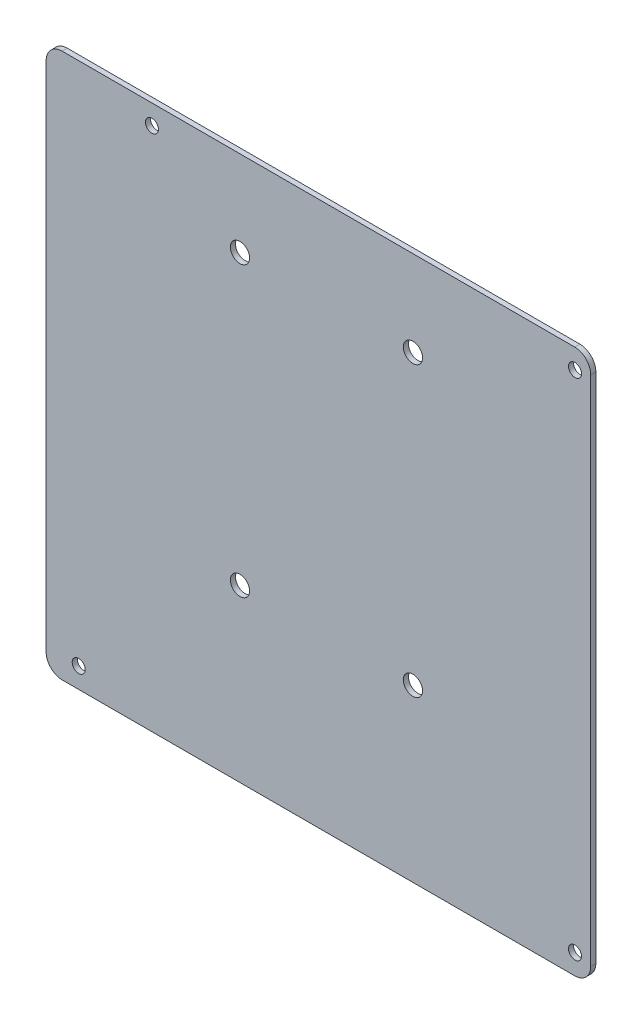
ISO-10303-21;
HEADER;
FILE_DESCRIPTION(('STEP AP214'),'2;1');
FILE_NAME('part.step','',(''),(''),'','','');
FILE_SCHEMA(('AUTOMOTIVE_DESIGN { 1 0 10303 214 1 1 1 1 }'));
ENDSEC;
DATA;
#1=APPLICATION_CONTEXT('core data for automotive mechanical design processes');
#2=APPLICATION_PROTOCOL_DEFINITION('international standard','automotive_design',2000,#1);
#3=PRODUCT_CONTEXT('',#1,'mechanical');
#4=PRODUCT('Part','Part','',(#3));
#5=PRODUCT_RELATED_PRODUCT_CATEGORY('part','',(#4));
#6=PRODUCT_DEFINITION_FORMATION('','',#4);
#7=PRODUCT_DEFINITION_CONTEXT('part definition',#1,'design');
#8=PRODUCT_DEFINITION('design','',#6,#7);
#9=PRODUCT_DEFINITION_SHAPE('','',#8);
#10=(LENGTH_UNIT() NAMED_UNIT(*) SI_UNIT(.MILLI.,.METRE.));
#11=(NAMED_UNIT(*) PLANE_ANGLE_UNIT() SI_UNIT($,.RADIAN.));
#12=(NAMED_UNIT(*) SI_UNIT($,.STERADIAN.) SOLID_ANGLE_UNIT());
#13=UNCERTAINTY_MEASURE_WITH_UNIT(LENGTH_MEASURE(1.E-05),#10,'distance_accuracy_value','');
#14=(GEOMETRIC_REPRESENTATION_CONTEXT(3) GLOBAL_UNCERTAINTY_ASSIGNED_CONTEXT((#13)) GLOBAL_UNIT_ASSIGNED_CONTEXT((#10,
#11,#12)) REPRESENTATION_CONTEXT('',''));
#15=CARTESIAN_POINT('',(0.,0.,0.));
#16=DIRECTION('',(0.,0.,1.));
#17=DIRECTION('',(1.,0.,0.));
#18=AXIS2_PLACEMENT_3D('',#15,#16,#17);
#19=CARTESIAN_POINT('',(149.920268508057,-111.047181825984,1.6));
#20=DIRECTION('',(0.,0.,-1.));
#21=DIRECTION('',(-1.,0.,0.));
#22=AXIS2_PLACEMENT_3D('',#19,#20,#21);
#23=PLANE('',#22);
#24=CARTESIAN_POINT('',(149.920268508057,-111.047181825984,1.6));
#25=DIRECTION('',(0.,0.,1.));
#26=DIRECTION('',(-1.,0.,0.));
#27=AXIS2_PLACEMENT_3D('',#24,#25,#26);
#28=CIRCLE('',#27,5.);
#29=CARTESIAN_POINT('',(149.920268508057,-116.047181825984,1.6));
#30=VERTEX_POINT('',#29);
#31=CARTESIAN_POINT('',(154.920268508057,-111.047181825984,1.6));
#32=VERTEX_POINT('',#31);
#33=EDGE_CURVE('E145',#30,#32,#28,.T.);
#34=ORIENTED_EDGE('',*,*,#33,.T.);
#35=DIRECTION('',(0.,1.,0.));
#36=VECTOR('',#35,1.);
#37=CARTESIAN_POINT('',(154.920268508057,48.9528181740162,1.6));
#38=LINE('',#37,#36);
#39=CARTESIAN_POINT('',(154.920268508057,48.9528181740162,1.6));
#40=VERTEX_POINT('',#39);
#41=EDGE_CURVE('E93',#32,#40,#38,.T.);
#42=ORIENTED_EDGE('',*,*,#41,.T.);
#43=CARTESIAN_POINT('',(149.920268508057,48.9528181740163,1.6));
#44=DIRECTION('',(0.,0.,1.));
#45=DIRECTION('',(-1.,0.,0.));
#46=AXIS2_PLACEMENT_3D('',#43,#44,#45);
#47=CIRCLE('',#46,5.);
#48=CARTESIAN_POINT('',(149.920268508057,53.9528181740163,1.6));
#49=VERTEX_POINT('',#48);
#50=EDGE_CURVE('E160',#40,#49,#47,.T.);
#51=ORIENTED_EDGE('',*,*,#50,.T.);
#52=DIRECTION('',(-1.,0.,0.));
#53=VECTOR('',#52,1.);
#54=CARTESIAN_POINT('',(-10.0797314919425,53.9528181740163,1.6));
#55=LINE('',#54,#53);
#56=CARTESIAN_POINT('',(-10.0797314919425,53.9528181740163,1.6));
#57=VERTEX_POINT('',#56);
#58=EDGE_CURVE('E173',#49,#57,#55,.T.);
#59=ORIENTED_EDGE('',*,*,#58,.T.);
#60=CARTESIAN_POINT('',(-10.0797314919426,48.9528181740163,1.6));
#61=DIRECTION('',(0.,0.,1.));
#62=DIRECTION('',(-1.,0.,0.));
#63=AXIS2_PLACEMENT_3D('',#60,#61,#62);
#64=CIRCLE('',#63,5.);
#65=CARTESIAN_POINT('',(-15.0797314919426,48.9528181740162,1.6));
#66=VERTEX_POINT('',#65);
#67=EDGE_CURVE('E112',#57,#66,#64,.T.);
#68=ORIENTED_EDGE('',*,*,#67,.T.);
#69=DIRECTION('',(0.,-1.,0.));
#70=VECTOR('',#69,1.);
#71=CARTESIAN_POINT('',(-15.0797314919426,-111.047181825984,1.6));
#72=LINE('',#71,#70);
#73=CARTESIAN_POINT('',(-15.0797314919426,-111.047181825984,1.6));
#74=VERTEX_POINT('',#73);
#75=EDGE_CURVE('E106',#66,#74,#72,.T.);
#76=ORIENTED_EDGE('',*,*,#75,.T.);
#77=CARTESIAN_POINT('',(-10.0797314919426,-111.047181825984,1.6));
#78=DIRECTION('',(0.,0.,1.));
#79=DIRECTION('',(1.,0.,0.));
#80=AXIS2_PLACEMENT_3D('',#77,#78,#79);
#81=CIRCLE('',#80,5.);
#82=CARTESIAN_POINT('',(-10.0797314919425,-116.047181825984,1.6));
#83=VERTEX_POINT('',#82);
#84=EDGE_CURVE('E110',#74,#83,#81,.T.);
#85=ORIENTED_EDGE('',*,*,#84,.T.);
#86=DIRECTION('',(1.,0.,0.));
#87=VECTOR('',#86,1.);
#88=CARTESIAN_POINT('',(149.920268508057,-116.047181825984,1.6));
#89=LINE('',#88,#87);
#90=EDGE_CURVE('E50',#83,#30,#89,.T.);
#91=ORIENTED_EDGE('',*,*,#90,.T.);
#92=EDGE_LOOP('',(#34,#42,#51,#59,#68,#76,#85,#91));
#93=FACE_BOUND('',#92,.T.);
#94=CARTESIAN_POINT('',(-4.91973149194258,-109.697181825984,1.6));
#95=DIRECTION('',(0.,0.,1.));
#96=DIRECTION('',(1.,0.,0.));
#97=AXIS2_PLACEMENT_3D('',#94,#95,#96);
#98=CIRCLE('',#97,2.032);
#99=CARTESIAN_POINT('',(-2.88773149194258,-109.697181825984,1.6));
#100=VERTEX_POINT('',#99);
#101=EDGE_CURVE('E134',#100,#100,#98,.T.);
#102=ORIENTED_EDGE('',*,*,#101,.F.);
#103=EDGE_LOOP('',(#102));
#104=FACE_BOUND('',#103,.T.);
#105=CARTESIAN_POINT('',(17.9402685080574,47.7828181740162,1.6));
#106=DIRECTION('',(0.,0.,1.));
#107=DIRECTION('',(1.,0.,0.));
#108=AXIS2_PLACEMENT_3D('',#105,#106,#107);
#109=CIRCLE('',#108,2.032);
#110=CARTESIAN_POINT('',(19.9722685080574,47.7828181740162,1.6));
#111=VERTEX_POINT('',#110);
#112=EDGE_CURVE('E182',#111,#111,#109,.T.);
#113=ORIENTED_EDGE('',*,*,#112,.F.);
#114=EDGE_LOOP('',(#113));
#115=FACE_BOUND('',#114,.T.);
#116=CARTESIAN_POINT('',(150.020268508057,47.7828181740162,1.6));
#117=DIRECTION('',(0.,0.,1.));
#118=DIRECTION('',(1.,0.,0.));
#119=AXIS2_PLACEMENT_3D('',#116,#117,#118);
#120=CIRCLE('',#119,2.03200000000001);
#121=CARTESIAN_POINT('',(152.052268508057,47.7828181740162,1.6));
#122=VERTEX_POINT('',#121);
#123=EDGE_CURVE('E188',#122,#122,#120,.T.);
#124=ORIENTED_EDGE('',*,*,#123,.F.);
#125=EDGE_LOOP('',(#124));
#126=FACE_BOUND('',#125,.T.);
#127=CARTESIAN_POINT('',(150.020268508057,-109.697181825984,1.6));
#128=DIRECTION('',(0.,0.,1.));
#129=DIRECTION('',(1.,0.,0.));
#130=AXIS2_PLACEMENT_3D('',#127,#128,#129);
#131=CIRCLE('',#130,2.03200000000001);
#132=CARTESIAN_POINT('',(152.052268508057,-109.697181825984,1.6));
#133=VERTEX_POINT('',#132);
#134=EDGE_CURVE('E194',#133,#133,#131,.T.);
#135=ORIENTED_EDGE('',*,*,#134,.F.);
#136=EDGE_LOOP('',(#135));
#137=FACE_BOUND('',#136,.T.);
#138=CARTESIAN_POINT('',(45.4202685080574,-62.7471818259837,1.6));
#139=DIRECTION('',(0.,0.,1.));
#140=DIRECTION('',(1.,0.,0.));
#141=AXIS2_PLACEMENT_3D('',#138,#139,#140);
#142=CIRCLE('',#141,2.99999999999999);
#143=CARTESIAN_POINT('',(48.4202685080574,-62.7471818259837,1.6));
#144=VERTEX_POINT('',#143);
#145=EDGE_CURVE('E200',#144,#144,#142,.T.);
#146=ORIENTED_EDGE('',*,*,#145,.F.);
#147=EDGE_LOOP('',(#146));
#148=FACE_BOUND('',#147,.T.);
#149=CARTESIAN_POINT('',(45.4202685080574,27.2528181740163,1.6));
#150=DIRECTION('',(0.,0.,1.));
#151=DIRECTION('',(1.,0.,0.));
#152=AXIS2_PLACEMENT_3D('',#149,#150,#151);
#153=CIRCLE('',#152,3.);
#154=CARTESIAN_POINT('',(48.4202685080574,27.2528181740163,1.6));
#155=VERTEX_POINT('',#154);
#156=EDGE_CURVE('E206',#155,#155,#153,.T.);
#157=ORIENTED_EDGE('',*,*,#156,.F.);
#158=EDGE_LOOP('',(#157));
#159=FACE_BOUND('',#158,.T.);
#160=CARTESIAN_POINT('',(99.4202685080574,27.2528181740163,1.6));
#161=DIRECTION('',(0.,0.,1.));
#162=DIRECTION('',(1.,0.,0.));
#163=AXIS2_PLACEMENT_3D('',#160,#161,#162);
#164=CIRCLE('',#163,2.99999999999999);
#165=CARTESIAN_POINT('',(102.420268508057,27.2528181740163,1.6));
#166=VERTEX_POINT('',#165);
#167=EDGE_CURVE('E212',#166,#166,#164,.T.);
#168=ORIENTED_EDGE('',*,*,#167,.F.);
#169=EDGE_LOOP('',(#168));
#170=FACE_BOUND('',#169,.T.);
#171=CARTESIAN_POINT('',(99.4202685080574,-62.7471818259837,1.6));
#172=DIRECTION('',(0.,0.,1.));
#173=DIRECTION('',(1.,0.,0.));
#174=AXIS2_PLACEMENT_3D('',#171,#172,#173);
#175=CIRCLE('',#174,3.00000000000001);
#176=CARTESIAN_POINT('',(102.420268508057,-62.7471818259837,1.6));
#177=VERTEX_POINT('',#176);
#178=EDGE_CURVE('E218',#177,#177,#175,.T.);
#179=ORIENTED_EDGE('',*,*,#178,.F.);
#180=EDGE_LOOP('',(#179));
#181=FACE_BOUND('',#180,.T.);
#182=ADVANCED_FACE('F33',(#93,#104,#115,#126,#137,#148,#159,#170,#181),#23,.F.);
#183=CARTESIAN_POINT('',(149.920268508057,-111.047181825984,0.));
#184=DIRECTION('',(0.,0.,-1.));
#185=DIRECTION('',(-1.,0.,0.));
#186=AXIS2_PLACEMENT_3D('',#183,#184,#185);
#187=PLANE('',#186);
#188=CARTESIAN_POINT('',(99.4202685080574,27.2528181740163,0.));
#189=DIRECTION('',(0.,0.,1.));
#190=DIRECTION('',(1.,0.,0.));
#191=AXIS2_PLACEMENT_3D('',#188,#189,#190);
#192=CIRCLE('',#191,2.99999999999999);
#193=CARTESIAN_POINT('',(102.420268508057,27.2528181740163,0.));
#194=VERTEX_POINT('',#193);
#195=EDGE_CURVE('E215',#194,#194,#192,.T.);
#196=ORIENTED_EDGE('',*,*,#195,.T.);
#197=EDGE_LOOP('',(#196));
#198=FACE_BOUND('',#197,.T.);
#199=CARTESIAN_POINT('',(45.4202685080574,-62.7471818259837,0.));
#200=DIRECTION('',(0.,0.,1.));
#201=DIRECTION('',(1.,0.,0.));
#202=AXIS2_PLACEMENT_3D('',#199,#200,#201);
#203=CIRCLE('',#202,2.99999999999999);
#204=CARTESIAN_POINT('',(48.4202685080574,-62.7471818259837,0.));
#205=VERTEX_POINT('',#204);
#206=EDGE_CURVE('E203',#205,#205,#203,.T.);
#207=ORIENTED_EDGE('',*,*,#206,.T.);
#208=EDGE_LOOP('',(#207));
#209=FACE_BOUND('',#208,.T.);
#210=CARTESIAN_POINT('',(150.020268508057,47.7828181740162,0.));
#211=DIRECTION('',(0.,0.,1.));
#212=DIRECTION('',(1.,0.,0.));
#213=AXIS2_PLACEMENT_3D('',#210,#211,#212);
#214=CIRCLE('',#213,2.03200000000001);
#215=CARTESIAN_POINT('',(152.052268508057,47.7828181740162,0.));
#216=VERTEX_POINT('',#215);
#217=EDGE_CURVE('E191',#216,#216,#214,.T.);
#218=ORIENTED_EDGE('',*,*,#217,.T.);
#219=EDGE_LOOP('',(#218));
#220=FACE_BOUND('',#219,.T.);
#221=CARTESIAN_POINT('',(-4.91973149194258,-109.697181825984,0.));
#222=DIRECTION('',(0.,0.,1.));
#223=DIRECTION('',(1.,0.,0.));
#224=AXIS2_PLACEMENT_3D('',#221,#222,#223);
#225=CIRCLE('',#224,2.032);
#226=CARTESIAN_POINT('',(-2.88773149194258,-109.697181825984,0.));
#227=VERTEX_POINT('',#226);
#228=EDGE_CURVE('E179',#227,#227,#225,.T.);
#229=ORIENTED_EDGE('',*,*,#228,.T.);
#230=EDGE_LOOP('',(#229));
#231=FACE_BOUND('',#230,.T.);
#232=CARTESIAN_POINT('',(149.920268508057,-111.047181825984,0.));
#233=DIRECTION('',(0.,0.,1.));
#234=DIRECTION('',(-1.,0.,0.));
#235=AXIS2_PLACEMENT_3D('',#232,#233,#234);
#236=CIRCLE('',#235,5.);
#237=CARTESIAN_POINT('',(149.920268508057,-116.047181825984,0.));
#238=VERTEX_POINT('',#237);
#239=CARTESIAN_POINT('',(154.920268508057,-111.047181825984,0.));
#240=VERTEX_POINT('',#239);
#241=EDGE_CURVE('E130',#238,#240,#236,.T.);
#242=ORIENTED_EDGE('',*,*,#241,.F.);
#243=DIRECTION('',(1.,0.,0.));
#244=VECTOR('',#243,1.);
#245=CARTESIAN_POINT('',(149.920268508057,-116.047181825984,0.));
#246=LINE('',#245,#244);
#247=CARTESIAN_POINT('',(-10.0797314919425,-116.047181825984,0.));
#248=VERTEX_POINT('',#247);
#249=EDGE_CURVE('E85',#248,#238,#246,.T.);
#250=ORIENTED_EDGE('',*,*,#249,.F.);
#251=CARTESIAN_POINT('',(-10.0797314919426,-111.047181825984,0.));
#252=DIRECTION('',(0.,0.,1.));
#253=DIRECTION('',(1.,0.,0.));
#254=AXIS2_PLACEMENT_3D('',#251,#252,#253);
#255=CIRCLE('',#254,5.);
#256=CARTESIAN_POINT('',(-15.0797314919426,-111.047181825984,0.));
#257=VERTEX_POINT('',#256);
#258=EDGE_CURVE('E79',#257,#248,#255,.T.);
#259=ORIENTED_EDGE('',*,*,#258,.F.);
#260=DIRECTION('',(0.,-1.,0.));
#261=VECTOR('',#260,1.);
#262=CARTESIAN_POINT('',(-15.0797314919426,-111.047181825984,0.));
#263=LINE('',#262,#261);
#264=CARTESIAN_POINT('',(-15.0797314919426,48.9528181740162,0.));
#265=VERTEX_POINT('',#264);
#266=EDGE_CURVE('E120',#265,#257,#263,.T.);
#267=ORIENTED_EDGE('',*,*,#266,.F.);
#268=CARTESIAN_POINT('',(-10.0797314919426,48.9528181740163,0.));
#269=DIRECTION('',(0.,0.,1.));
#270=DIRECTION('',(-1.,0.,0.));
#271=AXIS2_PLACEMENT_3D('',#268,#269,#270);
#272=CIRCLE('',#271,5.);
#273=CARTESIAN_POINT('',(-10.0797314919425,53.9528181740163,0.));
#274=VERTEX_POINT('',#273);
#275=EDGE_CURVE('E140',#274,#265,#272,.T.);
#276=ORIENTED_EDGE('',*,*,#275,.F.);
#277=DIRECTION('',(-1.,0.,0.));
#278=VECTOR('',#277,1.);
#279=CARTESIAN_POINT('',(-10.0797314919425,53.9528181740163,0.));
#280=LINE('',#279,#278);
#281=CARTESIAN_POINT('',(149.920268508057,53.9528181740163,0.));
#282=VERTEX_POINT('',#281);
#283=EDGE_CURVE('E138',#282,#274,#280,.T.);
#284=ORIENTED_EDGE('',*,*,#283,.F.);
#285=CARTESIAN_POINT('',(149.920268508057,48.9528181740163,0.));
#286=DIRECTION('',(0.,0.,1.));
#287=DIRECTION('',(-1.,0.,0.));
#288=AXIS2_PLACEMENT_3D('',#285,#286,#287);
#289=CIRCLE('',#288,5.);
#290=CARTESIAN_POINT('',(154.920268508057,48.9528181740162,0.));
#291=VERTEX_POINT('',#290);
#292=EDGE_CURVE('E136',#291,#282,#289,.T.);
#293=ORIENTED_EDGE('',*,*,#292,.F.);
#294=DIRECTION('',(0.,1.,0.));
#295=VECTOR('',#294,1.);
#296=CARTESIAN_POINT('',(154.920268508057,48.9528181740162,0.));
#297=LINE('',#296,#295);
#298=EDGE_CURVE('E133',#240,#291,#297,.T.);
#299=ORIENTED_EDGE('',*,*,#298,.F.);
#300=EDGE_LOOP('',(#242,#250,#259,#267,#276,#284,#293,#299));
#301=FACE_BOUND('',#300,.T.);
#302=CARTESIAN_POINT('',(17.9402685080574,47.7828181740162,0.));
#303=DIRECTION('',(0.,0.,1.));
#304=DIRECTION('',(1.,0.,0.));
#305=AXIS2_PLACEMENT_3D('',#302,#303,#304);
#306=CIRCLE('',#305,2.032);
#307=CARTESIAN_POINT('',(19.9722685080574,47.7828181740162,0.));
#308=VERTEX_POINT('',#307);
#309=EDGE_CURVE('E185',#308,#308,#306,.T.);
#310=ORIENTED_EDGE('',*,*,#309,.T.);
#311=EDGE_LOOP('',(#310));
#312=FACE_BOUND('',#311,.T.);
#313=CARTESIAN_POINT('',(150.020268508057,-109.697181825984,0.));
#314=DIRECTION('',(0.,0.,1.));
#315=DIRECTION('',(1.,0.,0.));
#316=AXIS2_PLACEMENT_3D('',#313,#314,#315);
#317=CIRCLE('',#316,2.03200000000001);
#318=CARTESIAN_POINT('',(152.052268508057,-109.697181825984,0.));
#319=VERTEX_POINT('',#318);
#320=EDGE_CURVE('E197',#319,#319,#317,.T.);
#321=ORIENTED_EDGE('',*,*,#320,.T.);
#322=EDGE_LOOP('',(#321));
#323=FACE_BOUND('',#322,.T.);
#324=CARTESIAN_POINT('',(45.4202685080574,27.2528181740163,0.));
#325=DIRECTION('',(0.,0.,1.));
#326=DIRECTION('',(1.,0.,0.));
#327=AXIS2_PLACEMENT_3D('',#324,#325,#326);
#328=CIRCLE('',#327,3.);
#329=CARTESIAN_POINT('',(48.4202685080574,27.2528181740163,0.));
#330=VERTEX_POINT('',#329);
#331=EDGE_CURVE('E209',#330,#330,#328,.T.);
#332=ORIENTED_EDGE('',*,*,#331,.T.);
#333=EDGE_LOOP('',(#332));
#334=FACE_BOUND('',#333,.T.);
#335=CARTESIAN_POINT('',(99.4202685080574,-62.7471818259837,0.));
#336=DIRECTION('',(0.,0.,1.));
#337=DIRECTION('',(1.,0.,0.));
#338=AXIS2_PLACEMENT_3D('',#335,#336,#337);
#339=CIRCLE('',#338,3.00000000000001);
#340=CARTESIAN_POINT('',(102.420268508057,-62.7471818259837,0.));
#341=VERTEX_POINT('',#340);
#342=EDGE_CURVE('E221',#341,#341,#339,.T.);
#343=ORIENTED_EDGE('',*,*,#342,.T.);
#344=EDGE_LOOP('',(#343));
#345=FACE_BOUND('',#344,.T.);
#346=ADVANCED_FACE('F164',(#198,#209,#220,#231,#301,#312,#323,#334,#345),#187,.T.);
#347=CARTESIAN_POINT('',(149.920268508057,-111.047181825984,1.6));
#348=DIRECTION('',(0.,0.,-1.));
#349=DIRECTION('',(-1.,0.,0.));
#350=AXIS2_PLACEMENT_3D('',#347,#348,#349);
#351=CYLINDRICAL_SURFACE('',#350,5.);
#352=ORIENTED_EDGE('',*,*,#241,.T.);
#353=DIRECTION('',(0.,0.,-1.));
#354=VECTOR('',#353,1.);
#355=CARTESIAN_POINT('',(154.920268508057,-111.047181825984,1.6));
#356=LINE('',#355,#354);
#357=EDGE_CURVE('E11',#32,#240,#356,.T.);
#358=ORIENTED_EDGE('',*,*,#357,.F.);
#359=ORIENTED_EDGE('',*,*,#33,.F.);
#360=DIRECTION('',(0.,0.,-1.));
#361=VECTOR('',#360,1.);
#362=CARTESIAN_POINT('',(149.920268508057,-116.047181825984,1.6));
#363=LINE('',#362,#361);
#364=EDGE_CURVE('E126',#30,#238,#363,.T.);
#365=ORIENTED_EDGE('',*,*,#364,.T.);
#366=EDGE_LOOP('',(#352,#358,#359,#365));
#367=FACE_BOUND('',#366,.T.);
#368=ADVANCED_FACE('F35',(#367),#351,.T.);
#369=CARTESIAN_POINT('',(154.920268508057,48.9528181740162,1.6));
#370=DIRECTION('',(-1.,0.,0.));
#371=DIRECTION('',(0.,0.,1.));
#372=AXIS2_PLACEMENT_3D('',#369,#370,#371);
#373=PLANE('',#372);
#374=ORIENTED_EDGE('',*,*,#298,.T.);
#375=DIRECTION('',(0.,0.,-1.));
#376=VECTOR('',#375,1.);
#377=CARTESIAN_POINT('',(154.920268508057,48.9528181740162,1.6));
#378=LINE('',#377,#376);
#379=EDGE_CURVE('E42',#40,#291,#378,.T.);
#380=ORIENTED_EDGE('',*,*,#379,.F.);
#381=ORIENTED_EDGE('',*,*,#41,.F.);
#382=ORIENTED_EDGE('',*,*,#357,.T.);
#383=EDGE_LOOP('',(#374,#380,#381,#382));
#384=FACE_BOUND('',#383,.T.);
#385=ADVANCED_FACE('F253',(#384),#373,.F.);
#386=CARTESIAN_POINT('',(149.920268508057,48.9528181740163,1.6));
#387=DIRECTION('',(0.,0.,-1.));
#388=DIRECTION('',(-1.,0.,0.));
#389=AXIS2_PLACEMENT_3D('',#386,#387,#388);
#390=CYLINDRICAL_SURFACE('',#389,5.);
#391=ORIENTED_EDGE('',*,*,#292,.T.);
#392=DIRECTION('',(0.,0.,-1.));
#393=VECTOR('',#392,1.);
#394=CARTESIAN_POINT('',(149.920268508057,53.9528181740163,1.6));
#395=LINE('',#394,#393);
#396=EDGE_CURVE('E152',#49,#282,#395,.T.);
#397=ORIENTED_EDGE('',*,*,#396,.F.);
#398=ORIENTED_EDGE('',*,*,#50,.F.);
#399=ORIENTED_EDGE('',*,*,#379,.T.);
#400=EDGE_LOOP('',(#391,#397,#398,#399));
#401=FACE_BOUND('',#400,.T.);
#402=ADVANCED_FACE('F158',(#401),#390,.T.);
#403=CARTESIAN_POINT('',(-10.0797314919425,53.9528181740163,1.6));
#404=DIRECTION('',(0.,-1.,0.));
#405=DIRECTION('',(0.,0.,-1.));
#406=AXIS2_PLACEMENT_3D('',#403,#404,#405);
#407=PLANE('',#406);
#408=ORIENTED_EDGE('',*,*,#283,.T.);
#409=DIRECTION('',(0.,0.,-1.));
#410=VECTOR('',#409,1.);
#411=CARTESIAN_POINT('',(-10.0797314919425,53.9528181740163,1.6));
#412=LINE('',#411,#410);
#413=EDGE_CURVE('E149',#57,#274,#412,.T.);
#414=ORIENTED_EDGE('',*,*,#413,.F.);
#415=ORIENTED_EDGE('',*,*,#58,.F.);
#416=ORIENTED_EDGE('',*,*,#396,.T.);
#417=EDGE_LOOP('',(#408,#414,#415,#416));
#418=FACE_BOUND('',#417,.T.);
#419=ADVANCED_FACE('F169',(#418),#407,.F.);
#420=CARTESIAN_POINT('',(-10.0797314919426,48.9528181740163,1.6));
#421=DIRECTION('',(0.,0.,-1.));
#422=DIRECTION('',(-1.,0.,0.));
#423=AXIS2_PLACEMENT_3D('',#420,#421,#422);
#424=CYLINDRICAL_SURFACE('',#423,5.);
#425=ORIENTED_EDGE('',*,*,#275,.T.);
#426=DIRECTION('',(0.,0.,-1.));
#427=VECTOR('',#426,1.);
#428=CARTESIAN_POINT('',(-15.0797314919426,48.9528181740162,1.6));
#429=LINE('',#428,#427);
#430=EDGE_CURVE('E121',#66,#265,#429,.T.);
#431=ORIENTED_EDGE('',*,*,#430,.F.);
#432=ORIENTED_EDGE('',*,*,#67,.F.);
#433=ORIENTED_EDGE('',*,*,#413,.T.);
#434=EDGE_LOOP('',(#425,#431,#432,#433));
#435=FACE_BOUND('',#434,.T.);
#436=ADVANCED_FACE('F172',(#435),#424,.T.);
#437=CARTESIAN_POINT('',(-15.0797314919426,-111.047181825984,1.6));
#438=DIRECTION('',(1.,0.,0.));
#439=DIRECTION('',(0.,0.,-1.));
#440=AXIS2_PLACEMENT_3D('',#437,#438,#439);
#441=PLANE('',#440);
#442=ORIENTED_EDGE('',*,*,#266,.T.);
#443=DIRECTION('',(0.,0.,-1.));
#444=VECTOR('',#443,1.);
#445=CARTESIAN_POINT('',(-15.0797314919426,-111.047181825984,1.6));
#446=LINE('',#445,#444);
#447=EDGE_CURVE('E117',#74,#257,#446,.T.);
#448=ORIENTED_EDGE('',*,*,#447,.F.);
#449=ORIENTED_EDGE('',*,*,#75,.F.);
#450=ORIENTED_EDGE('',*,*,#430,.T.);
#451=EDGE_LOOP('',(#442,#448,#449,#450));
#452=FACE_BOUND('',#451,.T.);
#453=ADVANCED_FACE('F118',(#452),#441,.F.);
#454=CARTESIAN_POINT('',(-10.0797314919426,-111.047181825984,1.6));
#455=DIRECTION('',(0.,0.,-1.));
#456=DIRECTION('',(-1.,0.,0.));
#457=AXIS2_PLACEMENT_3D('',#454,#455,#456);
#458=CYLINDRICAL_SURFACE('',#457,5.);
#459=ORIENTED_EDGE('',*,*,#258,.T.);
#460=DIRECTION('',(0.,0.,-1.));
#461=VECTOR('',#460,1.);
#462=CARTESIAN_POINT('',(-10.0797314919425,-116.047181825984,1.6));
#463=LINE('',#462,#461);
#464=EDGE_CURVE('E122',#83,#248,#463,.T.);
#465=ORIENTED_EDGE('',*,*,#464,.F.);
#466=ORIENTED_EDGE('',*,*,#84,.F.);
#467=ORIENTED_EDGE('',*,*,#447,.T.);
#468=EDGE_LOOP('',(#459,#465,#466,#467));
#469=FACE_BOUND('',#468,.T.);
#470=ADVANCED_FACE('F124',(#469),#458,.T.);
#471=CARTESIAN_POINT('',(149.920268508057,-116.047181825984,1.6));
#472=DIRECTION('',(0.,1.,0.));
#473=DIRECTION('',(0.,0.,1.));
#474=AXIS2_PLACEMENT_3D('',#471,#472,#473);
#475=PLANE('',#474);
#476=ORIENTED_EDGE('',*,*,#249,.T.);
#477=ORIENTED_EDGE('',*,*,#364,.F.);
#478=ORIENTED_EDGE('',*,*,#90,.F.);
#479=ORIENTED_EDGE('',*,*,#464,.T.);
#480=EDGE_LOOP('',(#476,#477,#478,#479));
#481=FACE_BOUND('',#480,.T.);
#482=ADVANCED_FACE('F241',(#481),#475,.F.);
#483=CARTESIAN_POINT('',(-4.91973149194258,-109.697181825984,1.6));
#484=DIRECTION('',(0.,0.,-1.));
#485=DIRECTION('',(-1.,0.,0.));
#486=AXIS2_PLACEMENT_3D('',#483,#484,#485);
#487=CYLINDRICAL_SURFACE('',#486,2.032);
#488=ORIENTED_EDGE('',*,*,#101,.T.);
#489=EDGE_LOOP('',(#488));
#490=FACE_BOUND('',#489,.T.);
#491=ORIENTED_EDGE('',*,*,#228,.F.);
#492=EDGE_LOOP('',(#491));
#493=FACE_BOUND('',#492,.T.);
#494=ADVANCED_FACE('F238',(#490,#493),#487,.F.);
#495=CARTESIAN_POINT('',(17.9402685080574,47.7828181740162,1.6));
#496=DIRECTION('',(0.,0.,-1.));
#497=DIRECTION('',(-1.,0.,0.));
#498=AXIS2_PLACEMENT_3D('',#495,#496,#497);
#499=CYLINDRICAL_SURFACE('',#498,2.032);
#500=ORIENTED_EDGE('',*,*,#112,.T.);
#501=EDGE_LOOP('',(#500));
#502=FACE_BOUND('',#501,.T.);
#503=ORIENTED_EDGE('',*,*,#309,.F.);
#504=EDGE_LOOP('',(#503));
#505=FACE_BOUND('',#504,.T.);
#506=ADVANCED_FACE('F317',(#502,#505),#499,.F.);
#507=CARTESIAN_POINT('',(150.020268508057,47.7828181740162,1.6));
#508=DIRECTION('',(0.,0.,-1.));
#509=DIRECTION('',(-1.,0.,0.));
#510=AXIS2_PLACEMENT_3D('',#507,#508,#509);
#511=CYLINDRICAL_SURFACE('',#510,2.03200000000001);
#512=ORIENTED_EDGE('',*,*,#123,.T.);
#513=EDGE_LOOP('',(#512));
#514=FACE_BOUND('',#513,.T.);
#515=ORIENTED_EDGE('',*,*,#217,.F.);
#516=EDGE_LOOP('',(#515));
#517=FACE_BOUND('',#516,.T.);
#518=ADVANCED_FACE('F325',(#514,#517),#511,.F.);
#519=CARTESIAN_POINT('',(150.020268508057,-109.697181825984,1.6));
#520=DIRECTION('',(0.,0.,-1.));
#521=DIRECTION('',(-1.,0.,0.));
#522=AXIS2_PLACEMENT_3D('',#519,#520,#521);
#523=CYLINDRICAL_SURFACE('',#522,2.03200000000001);
#524=ORIENTED_EDGE('',*,*,#134,.T.);
#525=EDGE_LOOP('',(#524));
#526=FACE_BOUND('',#525,.T.);
#527=ORIENTED_EDGE('',*,*,#320,.F.);
#528=EDGE_LOOP('',(#527));
#529=FACE_BOUND('',#528,.T.);
#530=ADVANCED_FACE('F333',(#526,#529),#523,.F.);
#531=CARTESIAN_POINT('',(45.4202685080574,-62.7471818259837,1.6));
#532=DIRECTION('',(0.,0.,-1.));
#533=DIRECTION('',(-1.,0.,0.));
#534=AXIS2_PLACEMENT_3D('',#531,#532,#533);
#535=CYLINDRICAL_SURFACE('',#534,2.99999999999999);
#536=ORIENTED_EDGE('',*,*,#145,.T.);
#537=EDGE_LOOP('',(#536));
#538=FACE_BOUND('',#537,.T.);
#539=ORIENTED_EDGE('',*,*,#206,.F.);
#540=EDGE_LOOP('',(#539));
#541=FACE_BOUND('',#540,.T.);
#542=ADVANCED_FACE('F342',(#538,#541),#535,.F.);
#543=CARTESIAN_POINT('',(45.4202685080574,27.2528181740163,1.6));
#544=DIRECTION('',(0.,0.,-1.));
#545=DIRECTION('',(-1.,0.,0.));
#546=AXIS2_PLACEMENT_3D('',#543,#544,#545);
#547=CYLINDRICAL_SURFACE('',#546,3.);
#548=ORIENTED_EDGE('',*,*,#156,.T.);
#549=EDGE_LOOP('',(#548));
#550=FACE_BOUND('',#549,.T.);
#551=ORIENTED_EDGE('',*,*,#331,.F.);
#552=EDGE_LOOP('',(#551));
#553=FACE_BOUND('',#552,.T.);
#554=ADVANCED_FACE('F351',(#550,#553),#547,.F.);
#555=CARTESIAN_POINT('',(99.4202685080574,27.2528181740163,1.6));
#556=DIRECTION('',(0.,0.,-1.));
#557=DIRECTION('',(-1.,0.,0.));
#558=AXIS2_PLACEMENT_3D('',#555,#556,#557);
#559=CYLINDRICAL_SURFACE('',#558,2.99999999999999);
#560=ORIENTED_EDGE('',*,*,#167,.T.);
#561=EDGE_LOOP('',(#560));
#562=FACE_BOUND('',#561,.T.);
#563=ORIENTED_EDGE('',*,*,#195,.F.);
#564=EDGE_LOOP('',(#563));
#565=FACE_BOUND('',#564,.T.);
#566=ADVANCED_FACE('F360',(#562,#565),#559,.F.);
#567=CARTESIAN_POINT('',(99.4202685080574,-62.7471818259837,1.6));
#568=DIRECTION('',(0.,0.,-1.));
#569=DIRECTION('',(-1.,0.,0.));
#570=AXIS2_PLACEMENT_3D('',#567,#568,#569);
#571=CYLINDRICAL_SURFACE('',#570,3.00000000000001);
#572=ORIENTED_EDGE('',*,*,#178,.T.);
#573=EDGE_LOOP('',(#572));
#574=FACE_BOUND('',#573,.T.);
#575=ORIENTED_EDGE('',*,*,#342,.F.);
#576=EDGE_LOOP('',(#575));
#577=FACE_BOUND('',#576,.T.);
#578=ADVANCED_FACE('F227',(#574,#577),#571,.F.);
#579=CLOSED_SHELL('',(#182,#346,#368,#385,#402,#419,#436,#453,#470,#482,#494,#506,#518,#530,
#542,#554,#566,#578));
#580=MANIFOLD_SOLID_BREP('B2',#579);
#581=ADVANCED_BREP_SHAPE_REPRESENTATION('',(#18,#580),#14);
#582=SHAPE_DEFINITION_REPRESENTATION(#9,#581);
ENDSEC;
END-ISO-10303-21;
